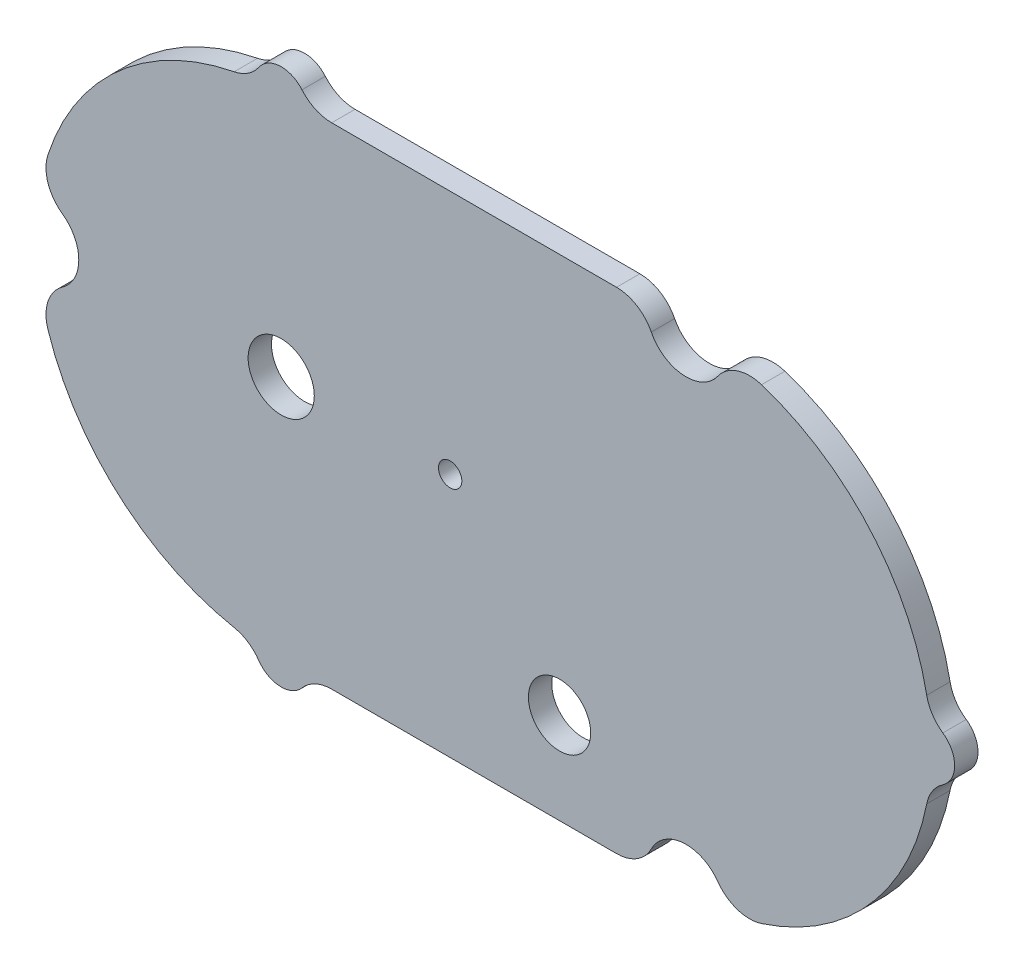
ISO-10303-21;
HEADER;
FILE_DESCRIPTION(('STEP AP214'),'2;1');
FILE_NAME('part.step','',(''),(''),'','','');
FILE_SCHEMA(('AUTOMOTIVE_DESIGN { 1 0 10303 214 1 1 1 1 }'));
ENDSEC;
DATA;
#1=APPLICATION_CONTEXT('core data for automotive mechanical design processes');
#2=APPLICATION_PROTOCOL_DEFINITION('international standard','automotive_design',2000,#1);
#3=PRODUCT_CONTEXT('',#1,'mechanical');
#4=PRODUCT('Part','Part','',(#3));
#5=PRODUCT_RELATED_PRODUCT_CATEGORY('part','',(#4));
#6=PRODUCT_DEFINITION_FORMATION('','',#4);
#7=PRODUCT_DEFINITION_CONTEXT('part definition',#1,'design');
#8=PRODUCT_DEFINITION('design','',#6,#7);
#9=PRODUCT_DEFINITION_SHAPE('','',#8);
#10=(LENGTH_UNIT() NAMED_UNIT(*) SI_UNIT(.MILLI.,.METRE.));
#11=(NAMED_UNIT(*) PLANE_ANGLE_UNIT() SI_UNIT($,.RADIAN.));
#12=(NAMED_UNIT(*) SI_UNIT($,.STERADIAN.) SOLID_ANGLE_UNIT());
#13=UNCERTAINTY_MEASURE_WITH_UNIT(LENGTH_MEASURE(1.E-05),#10,'distance_accuracy_value','');
#14=(GEOMETRIC_REPRESENTATION_CONTEXT(3) GLOBAL_UNCERTAINTY_ASSIGNED_CONTEXT((#13)) GLOBAL_UNIT_ASSIGNED_CONTEXT((#10,
#11,#12)) REPRESENTATION_CONTEXT('',''));
#15=CARTESIAN_POINT('',(0.,0.,0.));
#16=DIRECTION('',(0.,0.,1.));
#17=DIRECTION('',(1.,0.,0.));
#18=AXIS2_PLACEMENT_3D('',#15,#16,#17);
#19=CARTESIAN_POINT('',(0.,31.,-3.));
#20=DIRECTION('',(0.,0.,1.));
#21=DIRECTION('',(1.,0.,0.));
#22=AXIS2_PLACEMENT_3D('',#19,#20,#21);
#23=CYLINDRICAL_SURFACE('',#22,3.5);
#24=CARTESIAN_POINT('',(0.,31.,0.));
#25=DIRECTION('',(0.,0.,1.));
#26=DIRECTION('',(1.,0.,0.));
#27=AXIS2_PLACEMENT_3D('',#24,#25,#26);
#28=CIRCLE('',#27,3.5);
#29=CARTESIAN_POINT('',(2.6685402875797,33.2647058823529,0.));
#30=VERTEX_POINT('',#29);
#31=CARTESIAN_POINT('',(-2.8821386955939,32.9857685009488,0.));
#32=VERTEX_POINT('',#31);
#33=EDGE_CURVE('E307',#30,#32,#28,.T.);
#34=ORIENTED_EDGE('',*,*,#33,.F.);
#35=DIRECTION('',(0.,0.,1.));
#36=VECTOR('',#35,1.);
#37=CARTESIAN_POINT('',(2.6685402875797,33.2647058823529,-3.));
#38=LINE('',#37,#36);
#39=CARTESIAN_POINT('',(2.6685402875797,33.2647058823529,-3.));
#40=VERTEX_POINT('',#39);
#41=EDGE_CURVE('E354',#30,#40,#38,.F.);
#42=ORIENTED_EDGE('',*,*,#41,.T.);
#43=CARTESIAN_POINT('',(0.,31.,-3.));
#44=DIRECTION('',(0.,0.,1.));
#45=DIRECTION('',(1.,0.,0.));
#46=AXIS2_PLACEMENT_3D('',#43,#44,#45);
#47=CIRCLE('',#46,3.5);
#48=CARTESIAN_POINT('',(-2.8821386955939,32.9857685009488,-3.));
#49=VERTEX_POINT('',#48);
#50=EDGE_CURVE('E290',#40,#49,#47,.T.);
#51=ORIENTED_EDGE('',*,*,#50,.T.);
#52=DIRECTION('',(0.,0.,1.));
#53=VECTOR('',#52,1.);
#54=CARTESIAN_POINT('',(-2.8821386955939,32.9857685009488,-3.));
#55=LINE('',#54,#53);
#56=EDGE_CURVE('E352',#49,#32,#55,.T.);
#57=ORIENTED_EDGE('',*,*,#56,.T.);
#58=EDGE_LOOP('',(#34,#42,#51,#57));
#59=FACE_BOUND('',#58,.T.);
#60=ADVANCED_FACE('F37',(#59),#23,.T.);
#61=CARTESIAN_POINT('',(0.,31.5,-3.));
#62=DIRECTION('',(0.,-1.,0.));
#63=DIRECTION('',(1.,0.,0.));
#64=AXIS2_PLACEMENT_3D('',#61,#62,#63);
#65=PLANE('',#64);
#66=DIRECTION('',(1.,0.,0.));
#67=VECTOR('',#66,1.);
#68=CARTESIAN_POINT('',(0.,31.5,0.));
#69=LINE('',#68,#67);
#70=CARTESIAN_POINT('',(6.48074069840786,31.5,0.));
#71=VERTEX_POINT('',#70);
#72=CARTESIAN_POINT('',(43.0697144502541,31.5,0.));
#73=VERTEX_POINT('',#72);
#74=EDGE_CURVE('E230',#71,#73,#69,.T.);
#75=ORIENTED_EDGE('',*,*,#74,.T.);
#76=DIRECTION('',(0.,0.,-1.));
#77=VECTOR('',#76,1.);
#78=CARTESIAN_POINT('',(43.0697144502541,31.5,-3.));
#79=LINE('',#78,#77);
#80=CARTESIAN_POINT('',(43.0697144502541,31.5,-3.));
#81=VERTEX_POINT('',#80);
#82=EDGE_CURVE('E450',#73,#81,#79,.T.);
#83=ORIENTED_EDGE('',*,*,#82,.T.);
#84=DIRECTION('',(1.,0.,0.));
#85=VECTOR('',#84,1.);
#86=CARTESIAN_POINT('',(0.,31.5,-3.));
#87=LINE('',#86,#85);
#88=CARTESIAN_POINT('',(6.48074069840786,31.5,-3.));
#89=VERTEX_POINT('',#88);
#90=EDGE_CURVE('E320',#89,#81,#87,.T.);
#91=ORIENTED_EDGE('',*,*,#90,.F.);
#92=DIRECTION('',(0.,0.,1.));
#93=VECTOR('',#92,1.);
#94=CARTESIAN_POINT('',(6.48074069840786,31.5,-3.));
#95=LINE('',#94,#93);
#96=EDGE_CURVE('E452',#89,#71,#95,.T.);
#97=ORIENTED_EDGE('',*,*,#96,.T.);
#98=EDGE_LOOP('',(#75,#83,#91,#97));
#99=FACE_BOUND('',#98,.T.);
#100=ADVANCED_FACE('F475',(#99),#65,.F.);
#101=CARTESIAN_POINT('',(52.,31.,-3.));
#102=DIRECTION('',(0.,0.,1.));
#103=DIRECTION('',(1.,0.,0.));
#104=AXIS2_PLACEMENT_3D('',#101,#102,#103);
#105=CYLINDRICAL_SURFACE('',#104,5.);
#106=CARTESIAN_POINT('',(52.,31.,0.));
#107=DIRECTION('',(0.,0.,1.));
#108=DIRECTION('',(1.,0.,0.));
#109=AXIS2_PLACEMENT_3D('',#106,#107,#108);
#110=CIRCLE('',#109,5.);
#111=CARTESIAN_POINT('',(56.0779542758229,28.1068548387097,0.));
#112=VERTEX_POINT('',#111);
#113=CARTESIAN_POINT('',(47.534857225127,28.75,0.));
#114=VERTEX_POINT('',#113);
#115=EDGE_CURVE('E226',#112,#114,#110,.F.);
#116=ORIENTED_EDGE('',*,*,#115,.F.);
#117=DIRECTION('',(0.,0.,1.));
#118=VECTOR('',#117,1.);
#119=CARTESIAN_POINT('',(56.0779542758229,28.1068548387097,-3.));
#120=LINE('',#119,#118);
#121=CARTESIAN_POINT('',(56.0779542758229,28.1068548387097,-3.));
#122=VERTEX_POINT('',#121);
#123=EDGE_CURVE('E204',#112,#122,#120,.F.);
#124=ORIENTED_EDGE('',*,*,#123,.T.);
#125=CARTESIAN_POINT('',(52.,31.,-3.));
#126=DIRECTION('',(0.,0.,1.));
#127=DIRECTION('',(1.,0.,0.));
#128=AXIS2_PLACEMENT_3D('',#125,#126,#127);
#129=CIRCLE('',#128,5.);
#130=CARTESIAN_POINT('',(47.534857225127,28.75,-3.));
#131=VERTEX_POINT('',#130);
#132=EDGE_CURVE('E323',#122,#131,#129,.F.);
#133=ORIENTED_EDGE('',*,*,#132,.T.);
#134=DIRECTION('',(0.,0.,1.));
#135=VECTOR('',#134,1.);
#136=CARTESIAN_POINT('',(47.534857225127,28.75,-3.));
#137=LINE('',#136,#135);
#138=EDGE_CURVE('E209',#131,#114,#137,.T.);
#139=ORIENTED_EDGE('',*,*,#138,.T.);
#140=EDGE_LOOP('',(#116,#124,#133,#139));
#141=FACE_BOUND('',#140,.T.);
#142=ADVANCED_FACE('F469',(#141),#105,.F.);
#143=CARTESIAN_POINT('',(52.,0.,-3.));
#144=DIRECTION('',(0.,0.,1.));
#145=DIRECTION('',(1.,0.,0.));
#146=AXIS2_PLACEMENT_3D('',#143,#144,#145);
#147=CYLINDRICAL_SURFACE('',#146,31.5);
#148=CARTESIAN_POINT('',(52.,0.,-3.));
#149=DIRECTION('',(0.,0.,1.));
#150=DIRECTION('',(1.,0.,0.));
#151=AXIS2_PLACEMENT_3D('',#148,#149,#150);
#152=CIRCLE('',#151,31.5);
#153=CARTESIAN_POINT('',(61.6947592217677,29.97101339014,-3.));
#154=VERTEX_POINT('',#153);
#155=CARTESIAN_POINT('',(82.915377817057,6.04064685514886,-3.));
#156=VERTEX_POINT('',#155);
#157=EDGE_CURVE('E219',#154,#156,#152,.F.);
#158=ORIENTED_EDGE('',*,*,#157,.F.);
#159=DIRECTION('',(0.,0.,1.));
#160=VECTOR('',#159,1.);
#161=CARTESIAN_POINT('',(61.6947592217677,29.97101339014,-3.));
#162=LINE('',#161,#160);
#163=CARTESIAN_POINT('',(61.6947592217677,29.97101339014,0.));
#164=VERTEX_POINT('',#163);
#165=EDGE_CURVE('E203',#154,#164,#162,.T.);
#166=ORIENTED_EDGE('',*,*,#165,.T.);
#167=CARTESIAN_POINT('',(52.,0.,0.));
#168=DIRECTION('',(0.,0.,1.));
#169=DIRECTION('',(1.,0.,0.));
#170=AXIS2_PLACEMENT_3D('',#167,#168,#169);
#171=CIRCLE('',#170,31.5);
#172=CARTESIAN_POINT('',(82.915377817057,6.04064685514886,0.));
#173=VERTEX_POINT('',#172);
#174=EDGE_CURVE('E216',#164,#173,#171,.F.);
#175=ORIENTED_EDGE('',*,*,#174,.T.);
#176=DIRECTION('',(0.,0.,1.));
#177=VECTOR('',#176,1.);
#178=CARTESIAN_POINT('',(82.915377817057,6.04064685514886,-3.));
#179=LINE('',#178,#177);
#180=EDGE_CURVE('E221',#173,#156,#179,.F.);
#181=ORIENTED_EDGE('',*,*,#180,.T.);
#182=EDGE_LOOP('',(#158,#166,#175,#181));
#183=FACE_BOUND('',#182,.T.);
#184=ADVANCED_FACE('F215',(#183),#147,.T.);
#185=CARTESIAN_POINT('',(83.,0.,-3.));
#186=DIRECTION('',(0.,0.,1.));
#187=DIRECTION('',(1.,0.,0.));
#188=AXIS2_PLACEMENT_3D('',#185,#186,#187);
#189=CYLINDRICAL_SURFACE('',#188,3.50000000000001);
#190=CARTESIAN_POINT('',(83.,0.,0.));
#191=DIRECTION('',(0.,0.,1.));
#192=DIRECTION('',(1.,0.,0.));
#193=AXIS2_PLACEMENT_3D('',#190,#191,#192);
#194=CIRCLE('',#193,3.50000000000001);
#195=CARTESIAN_POINT('',(84.9857685009488,-2.8821386955939,0.));
#196=VERTEX_POINT('',#195);
#197=CARTESIAN_POINT('',(84.9857685009488,2.8821386955939,0.));
#198=VERTEX_POINT('',#197);
#199=EDGE_CURVE('E227',#196,#198,#194,.T.);
#200=ORIENTED_EDGE('',*,*,#199,.F.);
#201=DIRECTION('',(0.,0.,1.));
#202=VECTOR('',#201,1.);
#203=CARTESIAN_POINT('',(84.9857685009488,-2.8821386955939,-3.));
#204=LINE('',#203,#202);
#205=CARTESIAN_POINT('',(84.9857685009488,-2.8821386955939,-3.));
#206=VERTEX_POINT('',#205);
#207=EDGE_CURVE('E361',#196,#206,#204,.F.);
#208=ORIENTED_EDGE('',*,*,#207,.T.);
#209=CARTESIAN_POINT('',(83.,0.,-3.));
#210=DIRECTION('',(0.,0.,1.));
#211=DIRECTION('',(1.,0.,0.));
#212=AXIS2_PLACEMENT_3D('',#209,#210,#211);
#213=CIRCLE('',#212,3.50000000000001);
#214=CARTESIAN_POINT('',(84.9857685009488,2.8821386955939,-3.));
#215=VERTEX_POINT('',#214);
#216=EDGE_CURVE('E326',#206,#215,#213,.T.);
#217=ORIENTED_EDGE('',*,*,#216,.T.);
#218=DIRECTION('',(0.,0.,1.));
#219=VECTOR('',#218,1.);
#220=CARTESIAN_POINT('',(84.9857685009488,2.8821386955939,-3.));
#221=LINE('',#220,#219);
#222=EDGE_CURVE('E365',#215,#198,#221,.T.);
#223=ORIENTED_EDGE('',*,*,#222,.T.);
#224=EDGE_LOOP('',(#200,#208,#217,#223));
#225=FACE_BOUND('',#224,.T.);
#226=ADVANCED_FACE('F426',(#225),#189,.T.);
#227=CARTESIAN_POINT('',(82.915377817057,-6.04064685514887,0.));
#228=VERTEX_POINT('',#227);
#229=CARTESIAN_POINT('',(61.6947592217677,-29.97101339014,0.));
#230=VERTEX_POINT('',#229);
#231=EDGE_CURVE('E229',#228,#230,#171,.F.);
#232=ORIENTED_EDGE('',*,*,#231,.T.);
#233=DIRECTION('',(0.,0.,1.));
#234=VECTOR('',#233,1.);
#235=CARTESIAN_POINT('',(61.6947592217677,-29.97101339014,-3.));
#236=LINE('',#235,#234);
#237=CARTESIAN_POINT('',(61.6947592217677,-29.97101339014,-3.));
#238=VERTEX_POINT('',#237);
#239=EDGE_CURVE('E413',#230,#238,#236,.F.);
#240=ORIENTED_EDGE('',*,*,#239,.T.);
#241=CARTESIAN_POINT('',(82.915377817057,-6.04064685514887,-3.));
#242=VERTEX_POINT('',#241);
#243=EDGE_CURVE('E329',#242,#238,#152,.F.);
#244=ORIENTED_EDGE('',*,*,#243,.F.);
#245=DIRECTION('',(0.,0.,1.));
#246=VECTOR('',#245,1.);
#247=CARTESIAN_POINT('',(82.915377817057,-6.04064685514887,-3.));
#248=LINE('',#247,#246);
#249=EDGE_CURVE('E435',#242,#228,#248,.T.);
#250=ORIENTED_EDGE('',*,*,#249,.T.);
#251=EDGE_LOOP('',(#232,#240,#244,#250));
#252=FACE_BOUND('',#251,.T.);
#253=ADVANCED_FACE('F437',(#252),#147,.T.);
#254=CARTESIAN_POINT('',(52.,-31.,-3.));
#255=DIRECTION('',(0.,0.,1.));
#256=DIRECTION('',(1.,0.,0.));
#257=AXIS2_PLACEMENT_3D('',#254,#255,#256);
#258=CYLINDRICAL_SURFACE('',#257,5.);
#259=CARTESIAN_POINT('',(52.,-31.,0.));
#260=DIRECTION('',(0.,0.,1.));
#261=DIRECTION('',(1.,0.,0.));
#262=AXIS2_PLACEMENT_3D('',#259,#260,#261);
#263=CIRCLE('',#262,5.);
#264=CARTESIAN_POINT('',(47.534857225127,-28.75,0.));
#265=VERTEX_POINT('',#264);
#266=CARTESIAN_POINT('',(56.0779542758229,-28.1068548387097,0.));
#267=VERTEX_POINT('',#266);
#268=EDGE_CURVE('E235',#265,#267,#263,.F.);
#269=ORIENTED_EDGE('',*,*,#268,.F.);
#270=DIRECTION('',(0.,0.,1.));
#271=VECTOR('',#270,1.);
#272=CARTESIAN_POINT('',(47.534857225127,-28.75,-3.));
#273=LINE('',#272,#271);
#274=CARTESIAN_POINT('',(47.534857225127,-28.75,-3.));
#275=VERTEX_POINT('',#274);
#276=EDGE_CURVE('E438',#265,#275,#273,.F.);
#277=ORIENTED_EDGE('',*,*,#276,.T.);
#278=CARTESIAN_POINT('',(52.,-31.,-3.));
#279=DIRECTION('',(0.,0.,1.));
#280=DIRECTION('',(1.,0.,0.));
#281=AXIS2_PLACEMENT_3D('',#278,#279,#280);
#282=CIRCLE('',#281,5.);
#283=CARTESIAN_POINT('',(56.0779542758229,-28.1068548387097,-3.));
#284=VERTEX_POINT('',#283);
#285=EDGE_CURVE('E332',#275,#284,#282,.F.);
#286=ORIENTED_EDGE('',*,*,#285,.T.);
#287=DIRECTION('',(0.,0.,1.));
#288=VECTOR('',#287,1.);
#289=CARTESIAN_POINT('',(56.0779542758229,-28.1068548387097,-3.));
#290=LINE('',#289,#288);
#291=EDGE_CURVE('E440',#284,#267,#290,.T.);
#292=ORIENTED_EDGE('',*,*,#291,.T.);
#293=EDGE_LOOP('',(#269,#277,#286,#292));
#294=FACE_BOUND('',#293,.T.);
#295=ADVANCED_FACE('F543',(#294),#258,.F.);
#296=CARTESIAN_POINT('',(0.,-31.5,-3.));
#297=DIRECTION('',(0.,-1.,0.));
#298=DIRECTION('',(1.,0.,0.));
#299=AXIS2_PLACEMENT_3D('',#296,#297,#298);
#300=PLANE('',#299);
#301=DIRECTION('',(1.,0.,0.));
#302=VECTOR('',#301,1.);
#303=CARTESIAN_POINT('',(0.,-31.5,-3.));
#304=LINE('',#303,#302);
#305=CARTESIAN_POINT('',(6.48074069840787,-31.5,-3.));
#306=VERTEX_POINT('',#305);
#307=CARTESIAN_POINT('',(43.0697144502541,-31.5,-3.));
#308=VERTEX_POINT('',#307);
#309=EDGE_CURVE('E335',#306,#308,#304,.T.);
#310=ORIENTED_EDGE('',*,*,#309,.T.);
#311=DIRECTION('',(0.,0.,1.));
#312=VECTOR('',#311,1.);
#313=CARTESIAN_POINT('',(43.0697144502541,-31.5,-3.));
#314=LINE('',#313,#312);
#315=CARTESIAN_POINT('',(43.0697144502541,-31.5,0.));
#316=VERTEX_POINT('',#315);
#317=EDGE_CURVE('E445',#308,#316,#314,.T.);
#318=ORIENTED_EDGE('',*,*,#317,.T.);
#319=DIRECTION('',(1.,0.,0.));
#320=VECTOR('',#319,1.);
#321=CARTESIAN_POINT('',(0.,-31.5,0.));
#322=LINE('',#321,#320);
#323=CARTESIAN_POINT('',(6.48074069840787,-31.5,0.));
#324=VERTEX_POINT('',#323);
#325=EDGE_CURVE('E241',#324,#316,#322,.T.);
#326=ORIENTED_EDGE('',*,*,#325,.F.);
#327=DIRECTION('',(0.,0.,-1.));
#328=VECTOR('',#327,1.);
#329=CARTESIAN_POINT('',(6.48074069840787,-31.5,-3.));
#330=LINE('',#329,#328);
#331=EDGE_CURVE('E448',#324,#306,#330,.T.);
#332=ORIENTED_EDGE('',*,*,#331,.T.);
#333=EDGE_LOOP('',(#310,#318,#326,#332));
#334=FACE_BOUND('',#333,.T.);
#335=ADVANCED_FACE('F550',(#334),#300,.T.);
#336=CARTESIAN_POINT('',(0.,-31.,-3.));
#337=DIRECTION('',(0.,0.,1.));
#338=DIRECTION('',(1.,0.,0.));
#339=AXIS2_PLACEMENT_3D('',#336,#337,#338);
#340=CYLINDRICAL_SURFACE('',#339,3.5);
#341=CARTESIAN_POINT('',(0.,-31.,0.));
#342=DIRECTION('',(0.,0.,1.));
#343=DIRECTION('',(1.,0.,0.));
#344=AXIS2_PLACEMENT_3D('',#341,#342,#343);
#345=CIRCLE('',#344,3.5);
#346=CARTESIAN_POINT('',(-2.88213869559389,-32.9857685009488,0.));
#347=VERTEX_POINT('',#346);
#348=CARTESIAN_POINT('',(2.66854028757972,-33.2647058823529,0.));
#349=VERTEX_POINT('',#348);
#350=EDGE_CURVE('E244',#347,#349,#345,.T.);
#351=ORIENTED_EDGE('',*,*,#350,.F.);
#352=DIRECTION('',(0.,0.,1.));
#353=VECTOR('',#352,1.);
#354=CARTESIAN_POINT('',(-2.88213869559389,-32.9857685009488,-3.));
#355=LINE('',#354,#353);
#356=CARTESIAN_POINT('',(-2.88213869559389,-32.9857685009488,-3.));
#357=VERTEX_POINT('',#356);
#358=EDGE_CURVE('E421',#347,#357,#355,.F.);
#359=ORIENTED_EDGE('',*,*,#358,.T.);
#360=CARTESIAN_POINT('',(0.,-31.,-3.));
#361=DIRECTION('',(0.,0.,1.));
#362=DIRECTION('',(1.,0.,0.));
#363=AXIS2_PLACEMENT_3D('',#360,#361,#362);
#364=CIRCLE('',#363,3.5);
#365=CARTESIAN_POINT('',(2.66854028757972,-33.2647058823529,-3.));
#366=VERTEX_POINT('',#365);
#367=EDGE_CURVE('E338',#357,#366,#364,.T.);
#368=ORIENTED_EDGE('',*,*,#367,.T.);
#369=DIRECTION('',(0.,0.,1.));
#370=VECTOR('',#369,1.);
#371=CARTESIAN_POINT('',(2.66854028757972,-33.2647058823529,-3.));
#372=LINE('',#371,#370);
#373=EDGE_CURVE('E418',#366,#349,#372,.T.);
#374=ORIENTED_EDGE('',*,*,#373,.T.);
#375=EDGE_LOOP('',(#351,#359,#368,#374));
#376=FACE_BOUND('',#375,.T.);
#377=ADVANCED_FACE('F530',(#376),#340,.T.);
#378=CARTESIAN_POINT('',(0.,0.,-3.));
#379=DIRECTION('',(0.,0.,1.));
#380=DIRECTION('',(1.,0.,0.));
#381=AXIS2_PLACEMENT_3D('',#378,#379,#380);
#382=CYLINDRICAL_SURFACE('',#381,31.5);
#383=CARTESIAN_POINT('',(0.,0.,0.));
#384=DIRECTION('',(0.,0.,1.));
#385=DIRECTION('',(1.,0.,0.));
#386=AXIS2_PLACEMENT_3D('',#383,#384,#385);
#387=CIRCLE('',#386,31.5);
#388=CARTESIAN_POINT('',(-29.97101339014,-9.69475922176769,0.));
#389=VERTEX_POINT('',#388);
#390=CARTESIAN_POINT('',(-6.04064685514883,-30.915377817057,0.));
#391=VERTEX_POINT('',#390);
#392=EDGE_CURVE('E303',#389,#391,#387,.T.);
#393=ORIENTED_EDGE('',*,*,#392,.F.);
#394=DIRECTION('',(0.,0.,1.));
#395=VECTOR('',#394,1.);
#396=CARTESIAN_POINT('',(-29.97101339014,-9.69475922176769,-3.));
#397=LINE('',#396,#395);
#398=CARTESIAN_POINT('',(-29.97101339014,-9.69475922176769,-3.));
#399=VERTEX_POINT('',#398);
#400=EDGE_CURVE('E411',#389,#399,#397,.F.);
#401=ORIENTED_EDGE('',*,*,#400,.T.);
#402=CARTESIAN_POINT('',(0.,0.,-3.));
#403=DIRECTION('',(0.,0.,1.));
#404=DIRECTION('',(1.,0.,0.));
#405=AXIS2_PLACEMENT_3D('',#402,#403,#404);
#406=CIRCLE('',#405,31.5);
#407=CARTESIAN_POINT('',(-6.04064685514883,-30.915377817057,-3.));
#408=VERTEX_POINT('',#407);
#409=EDGE_CURVE('E341',#399,#408,#406,.T.);
#410=ORIENTED_EDGE('',*,*,#409,.T.);
#411=DIRECTION('',(0.,0.,1.));
#412=VECTOR('',#411,1.);
#413=CARTESIAN_POINT('',(-6.04064685514883,-30.915377817057,-3.));
#414=LINE('',#413,#412);
#415=EDGE_CURVE('E408',#408,#391,#414,.T.);
#416=ORIENTED_EDGE('',*,*,#415,.T.);
#417=EDGE_LOOP('',(#393,#401,#410,#416));
#418=FACE_BOUND('',#417,.T.);
#419=ADVANCED_FACE('F538',(#418),#382,.T.);
#420=CARTESIAN_POINT('',(-31.,0.,-3.));
#421=DIRECTION('',(0.,0.,1.));
#422=DIRECTION('',(1.,0.,0.));
#423=AXIS2_PLACEMENT_3D('',#420,#421,#422);
#424=CYLINDRICAL_SURFACE('',#423,5.);
#425=CARTESIAN_POINT('',(-31.,0.,-3.));
#426=DIRECTION('',(0.,0.,1.));
#427=DIRECTION('',(1.,0.,0.));
#428=AXIS2_PLACEMENT_3D('',#425,#426,#427);
#429=CIRCLE('',#428,5.);
#430=CARTESIAN_POINT('',(-28.1068548387097,-4.07795427582292,-3.));
#431=VERTEX_POINT('',#430);
#432=CARTESIAN_POINT('',(-28.1068548387097,4.07795427582291,-3.));
#433=VERTEX_POINT('',#432);
#434=EDGE_CURVE('E342',#431,#433,#429,.T.);
#435=ORIENTED_EDGE('',*,*,#434,.F.);
#436=DIRECTION('',(0.,0.,1.));
#437=VECTOR('',#436,1.);
#438=CARTESIAN_POINT('',(-28.1068548387097,-4.07795427582292,-3.));
#439=LINE('',#438,#437);
#440=CARTESIAN_POINT('',(-28.1068548387097,-4.07795427582292,0.));
#441=VERTEX_POINT('',#440);
#442=EDGE_CURVE('E405',#431,#441,#439,.T.);
#443=ORIENTED_EDGE('',*,*,#442,.T.);
#444=CARTESIAN_POINT('',(-31.,0.,0.));
#445=DIRECTION('',(0.,0.,1.));
#446=DIRECTION('',(1.,0.,0.));
#447=AXIS2_PLACEMENT_3D('',#444,#445,#446);
#448=CIRCLE('',#447,5.);
#449=CARTESIAN_POINT('',(-28.1068548387097,4.07795427582291,0.));
#450=VERTEX_POINT('',#449);
#451=EDGE_CURVE('E300',#441,#450,#448,.T.);
#452=ORIENTED_EDGE('',*,*,#451,.T.);
#453=DIRECTION('',(0.,0.,1.));
#454=VECTOR('',#453,1.);
#455=CARTESIAN_POINT('',(-28.1068548387097,4.07795427582291,-3.));
#456=LINE('',#455,#454);
#457=EDGE_CURVE('E398',#450,#433,#456,.F.);
#458=ORIENTED_EDGE('',*,*,#457,.T.);
#459=EDGE_LOOP('',(#435,#443,#452,#458));
#460=FACE_BOUND('',#459,.T.);
#461=ADVANCED_FACE('F403',(#460),#424,.F.);
#462=CARTESIAN_POINT('',(21.7,0.,-3.));
#463=DIRECTION('',(0.,0.,1.));
#464=DIRECTION('',(1.,0.,0.));
#465=AXIS2_PLACEMENT_3D('',#462,#463,#464);
#466=CYLINDRICAL_SURFACE('',#465,1.5);
#467=CARTESIAN_POINT('',(21.7,0.,-3.));
#468=DIRECTION('',(0.,0.,1.));
#469=DIRECTION('',(1.,0.,0.));
#470=AXIS2_PLACEMENT_3D('',#467,#468,#469);
#471=CIRCLE('',#470,1.5);
#472=CARTESIAN_POINT('',(23.2,0.,-3.));
#473=VERTEX_POINT('',#472);
#474=EDGE_CURVE('E314',#473,#473,#471,.T.);
#475=ORIENTED_EDGE('',*,*,#474,.F.);
#476=EDGE_LOOP('',(#475));
#477=FACE_BOUND('',#476,.T.);
#478=CARTESIAN_POINT('',(21.7,0.,0.));
#479=DIRECTION('',(0.,0.,1.));
#480=DIRECTION('',(1.,0.,0.));
#481=AXIS2_PLACEMENT_3D('',#478,#479,#480);
#482=CIRCLE('',#481,1.5);
#483=CARTESIAN_POINT('',(23.2,0.,0.));
#484=VERTEX_POINT('',#483);
#485=EDGE_CURVE('E281',#484,#484,#482,.T.);
#486=ORIENTED_EDGE('',*,*,#485,.T.);
#487=EDGE_LOOP('',(#486));
#488=FACE_BOUND('',#487,.T.);
#489=ADVANCED_FACE('F564',(#477,#488),#466,.F.);
#490=CARTESIAN_POINT('',(35.75,-19.75,-3.));
#491=DIRECTION('',(0.,0.,1.));
#492=DIRECTION('',(1.,0.,0.));
#493=AXIS2_PLACEMENT_3D('',#490,#491,#492);
#494=CYLINDRICAL_SURFACE('',#493,4.00000000000001);
#495=CARTESIAN_POINT('',(35.75,-19.75,-3.));
#496=DIRECTION('',(0.,0.,1.));
#497=DIRECTION('',(1.,0.,0.));
#498=AXIS2_PLACEMENT_3D('',#495,#496,#497);
#499=CIRCLE('',#498,4.00000000000001);
#500=CARTESIAN_POINT('',(39.75,-19.75,-3.));
#501=VERTEX_POINT('',#500);
#502=EDGE_CURVE('E317',#501,#501,#499,.T.);
#503=ORIENTED_EDGE('',*,*,#502,.F.);
#504=EDGE_LOOP('',(#503));
#505=FACE_BOUND('',#504,.T.);
#506=CARTESIAN_POINT('',(35.75,-19.75,0.));
#507=DIRECTION('',(0.,0.,1.));
#508=DIRECTION('',(1.,0.,0.));
#509=AXIS2_PLACEMENT_3D('',#506,#507,#508);
#510=CIRCLE('',#509,4.00000000000001);
#511=CARTESIAN_POINT('',(39.75,-19.75,0.));
#512=VERTEX_POINT('',#511);
#513=EDGE_CURVE('E277',#512,#512,#510,.T.);
#514=ORIENTED_EDGE('',*,*,#513,.T.);
#515=EDGE_LOOP('',(#514));
#516=FACE_BOUND('',#515,.T.);
#517=ADVANCED_FACE('F567',(#505,#516),#494,.F.);
#518=CARTESIAN_POINT('',(-6.04064685514886,30.915377817057,0.));
#519=VERTEX_POINT('',#518);
#520=CARTESIAN_POINT('',(-29.97101339014,9.69475922176767,0.));
#521=VERTEX_POINT('',#520);
#522=EDGE_CURVE('E304',#519,#521,#387,.T.);
#523=ORIENTED_EDGE('',*,*,#522,.F.);
#524=DIRECTION('',(0.,0.,1.));
#525=VECTOR('',#524,1.);
#526=CARTESIAN_POINT('',(-6.04064685514886,30.915377817057,-3.));
#527=LINE('',#526,#525);
#528=CARTESIAN_POINT('',(-6.04064685514886,30.915377817057,-3.));
#529=VERTEX_POINT('',#528);
#530=EDGE_CURVE('E59',#519,#529,#527,.F.);
#531=ORIENTED_EDGE('',*,*,#530,.T.);
#532=CARTESIAN_POINT('',(-29.97101339014,9.69475922176767,-3.));
#533=VERTEX_POINT('',#532);
#534=EDGE_CURVE('E344',#529,#533,#406,.T.);
#535=ORIENTED_EDGE('',*,*,#534,.T.);
#536=DIRECTION('',(0.,0.,1.));
#537=VECTOR('',#536,1.);
#538=CARTESIAN_POINT('',(-29.97101339014,9.69475922176767,-3.));
#539=LINE('',#538,#537);
#540=EDGE_CURVE('E363',#533,#521,#539,.T.);
#541=ORIENTED_EDGE('',*,*,#540,.T.);
#542=EDGE_LOOP('',(#523,#531,#535,#541));
#543=FACE_BOUND('',#542,.T.);
#544=ADVANCED_FACE('F393',(#543),#382,.T.);
#545=CARTESIAN_POINT('',(0.,0.,-3.));
#546=DIRECTION('',(0.,0.,1.));
#547=DIRECTION('',(1.,0.,0.));
#548=AXIS2_PLACEMENT_3D('',#545,#546,#547);
#549=CYLINDRICAL_SURFACE('',#548,4.25);
#550=CARTESIAN_POINT('',(0.,0.,-3.));
#551=DIRECTION('',(0.,0.,1.));
#552=DIRECTION('',(1.,0.,0.));
#553=AXIS2_PLACEMENT_3D('',#550,#551,#552);
#554=CIRCLE('',#553,4.25);
#555=CARTESIAN_POINT('',(4.25,0.,-3.));
#556=VERTEX_POINT('',#555);
#557=EDGE_CURVE('E291',#556,#556,#554,.T.);
#558=ORIENTED_EDGE('',*,*,#557,.F.);
#559=EDGE_LOOP('',(#558));
#560=FACE_BOUND('',#559,.T.);
#561=CARTESIAN_POINT('',(0.,0.,0.));
#562=DIRECTION('',(0.,0.,1.));
#563=DIRECTION('',(1.,0.,0.));
#564=AXIS2_PLACEMENT_3D('',#561,#562,#563);
#565=CIRCLE('',#564,4.25);
#566=CARTESIAN_POINT('',(4.25,0.,0.));
#567=VERTEX_POINT('',#566);
#568=EDGE_CURVE('E286',#567,#567,#565,.T.);
#569=ORIENTED_EDGE('',*,*,#568,.T.);
#570=EDGE_LOOP('',(#569));
#571=FACE_BOUND('',#570,.T.);
#572=ADVANCED_FACE('F566',(#560,#571),#549,.F.);
#573=CARTESIAN_POINT('',(0.,0.,-3.));
#574=DIRECTION('',(0.,0.,1.));
#575=DIRECTION('',(1.,0.,0.));
#576=AXIS2_PLACEMENT_3D('',#573,#574,#575);
#577=PLANE('',#576);
#578=ORIENTED_EDGE('',*,*,#132,.F.);
#579=CARTESIAN_POINT('',(60.1559085516458,25.2137096774194,-3.));
#580=DIRECTION('',(0.,0.,1.));
#581=DIRECTION('',(1.,0.,0.));
#582=AXIS2_PLACEMENT_3D('',#579,#580,#581);
#583=CIRCLE('',#582,5.);
#584=EDGE_CURVE('E455',#122,#154,#583,.F.);
#585=ORIENTED_EDGE('',*,*,#584,.T.);
#586=ORIENTED_EDGE('',*,*,#157,.T.);
#587=CARTESIAN_POINT('',(87.8225806451613,6.99947968929947,-3.));
#588=DIRECTION('',(0.,0.,1.));
#589=DIRECTION('',(1.,0.,0.));
#590=AXIS2_PLACEMENT_3D('',#587,#588,#589);
#591=CIRCLE('',#590,5.);
#592=EDGE_CURVE('E12',#156,#215,#591,.T.);
#593=ORIENTED_EDGE('',*,*,#592,.T.);
#594=ORIENTED_EDGE('',*,*,#216,.F.);
#595=CARTESIAN_POINT('',(87.8225806451613,-6.99947968929948,-3.));
#596=DIRECTION('',(0.,0.,1.));
#597=DIRECTION('',(1.,0.,0.));
#598=AXIS2_PLACEMENT_3D('',#595,#596,#597);
#599=CIRCLE('',#598,5.);
#600=EDGE_CURVE('E382',#206,#242,#599,.T.);
#601=ORIENTED_EDGE('',*,*,#600,.T.);
#602=ORIENTED_EDGE('',*,*,#243,.T.);
#603=CARTESIAN_POINT('',(60.1559085516458,-25.2137096774194,-3.));
#604=DIRECTION('',(0.,0.,1.));
#605=DIRECTION('',(1.,0.,0.));
#606=AXIS2_PLACEMENT_3D('',#603,#604,#605);
#607=CIRCLE('',#606,5.);
#608=EDGE_CURVE('E461',#238,#284,#607,.F.);
#609=ORIENTED_EDGE('',*,*,#608,.T.);
#610=ORIENTED_EDGE('',*,*,#285,.F.);
#611=CARTESIAN_POINT('',(43.0697144502541,-26.5,-3.));
#612=DIRECTION('',(0.,0.,1.));
#613=DIRECTION('',(1.,0.,0.));
#614=AXIS2_PLACEMENT_3D('',#611,#612,#613);
#615=CIRCLE('',#614,5.);
#616=EDGE_CURVE('E459',#275,#308,#615,.F.);
#617=ORIENTED_EDGE('',*,*,#616,.T.);
#618=ORIENTED_EDGE('',*,*,#309,.F.);
#619=CARTESIAN_POINT('',(6.48074069840787,-36.5,-3.));
#620=DIRECTION('',(0.,0.,1.));
#621=DIRECTION('',(1.,0.,0.));
#622=AXIS2_PLACEMENT_3D('',#619,#620,#621);
#623=CIRCLE('',#622,5.);
#624=EDGE_CURVE('E378',#306,#366,#623,.T.);
#625=ORIENTED_EDGE('',*,*,#624,.T.);
#626=ORIENTED_EDGE('',*,*,#367,.F.);
#627=CARTESIAN_POINT('',(-6.99947968929944,-35.8225806451613,-3.));
#628=DIRECTION('',(0.,0.,1.));
#629=DIRECTION('',(1.,0.,0.));
#630=AXIS2_PLACEMENT_3D('',#627,#628,#629);
#631=CIRCLE('',#630,5.);
#632=EDGE_CURVE('E374',#357,#408,#631,.T.);
#633=ORIENTED_EDGE('',*,*,#632,.T.);
#634=ORIENTED_EDGE('',*,*,#409,.F.);
#635=CARTESIAN_POINT('',(-25.2137096774194,-8.15590855164583,-3.));
#636=DIRECTION('',(0.,0.,1.));
#637=DIRECTION('',(1.,0.,0.));
#638=AXIS2_PLACEMENT_3D('',#635,#636,#637);
#639=CIRCLE('',#638,5.);
#640=EDGE_CURVE('E463',#399,#431,#639,.F.);
#641=ORIENTED_EDGE('',*,*,#640,.T.);
#642=ORIENTED_EDGE('',*,*,#434,.T.);
#643=CARTESIAN_POINT('',(-25.2137096774194,8.15590855164582,-3.));
#644=DIRECTION('',(0.,0.,1.));
#645=DIRECTION('',(1.,0.,0.));
#646=AXIS2_PLACEMENT_3D('',#643,#644,#645);
#647=CIRCLE('',#646,5.);
#648=EDGE_CURVE('E52',#433,#533,#647,.F.);
#649=ORIENTED_EDGE('',*,*,#648,.T.);
#650=ORIENTED_EDGE('',*,*,#534,.F.);
#651=CARTESIAN_POINT('',(-6.99947968929947,35.8225806451613,-3.));
#652=DIRECTION('',(0.,0.,1.));
#653=DIRECTION('',(1.,0.,0.));
#654=AXIS2_PLACEMENT_3D('',#651,#652,#653);
#655=CIRCLE('',#654,5.);
#656=EDGE_CURVE('E359',#529,#49,#655,.T.);
#657=ORIENTED_EDGE('',*,*,#656,.T.);
#658=ORIENTED_EDGE('',*,*,#50,.F.);
#659=CARTESIAN_POINT('',(6.48074069840786,36.5,-3.));
#660=DIRECTION('',(0.,0.,1.));
#661=DIRECTION('',(1.,0.,0.));
#662=AXIS2_PLACEMENT_3D('',#659,#660,#661);
#663=CIRCLE('',#662,5.);
#664=EDGE_CURVE('E386',#40,#89,#663,.T.);
#665=ORIENTED_EDGE('',*,*,#664,.T.);
#666=ORIENTED_EDGE('',*,*,#90,.T.);
#667=CARTESIAN_POINT('',(43.0697144502541,26.5,-3.));
#668=DIRECTION('',(0.,0.,1.));
#669=DIRECTION('',(1.,0.,0.));
#670=AXIS2_PLACEMENT_3D('',#667,#668,#669);
#671=CIRCLE('',#670,5.);
#672=EDGE_CURVE('E457',#81,#131,#671,.F.);
#673=ORIENTED_EDGE('',*,*,#672,.T.);
#674=EDGE_LOOP('',(#578,#585,#586,#593,#594,#601,#602,#609,#610,#617,#618,#625,#626,#633,#634,
#641,#642,#649,#650,#657,#658,#665,#666,#673));
#675=FACE_BOUND('',#674,.T.);
#676=ORIENTED_EDGE('',*,*,#502,.T.);
#677=EDGE_LOOP('',(#676));
#678=FACE_BOUND('',#677,.T.);
#679=ORIENTED_EDGE('',*,*,#474,.T.);
#680=EDGE_LOOP('',(#679));
#681=FACE_BOUND('',#680,.T.);
#682=ORIENTED_EDGE('',*,*,#557,.T.);
#683=EDGE_LOOP('',(#682));
#684=FACE_BOUND('',#683,.T.);
#685=ADVANCED_FACE('F390',(#675,#678,#681,#684),#577,.F.);
#686=CARTESIAN_POINT('',(0.,0.,0.));
#687=DIRECTION('',(0.,0.,1.));
#688=DIRECTION('',(1.,0.,0.));
#689=AXIS2_PLACEMENT_3D('',#686,#687,#688);
#690=PLANE('',#689);
#691=ORIENTED_EDGE('',*,*,#174,.F.);
#692=CARTESIAN_POINT('',(60.1559085516458,25.2137096774194,0.));
#693=DIRECTION('',(0.,0.,1.));
#694=DIRECTION('',(1.,0.,0.));
#695=AXIS2_PLACEMENT_3D('',#692,#693,#694);
#696=CIRCLE('',#695,5.);
#697=EDGE_CURVE('E199',#164,#112,#696,.T.);
#698=ORIENTED_EDGE('',*,*,#697,.T.);
#699=ORIENTED_EDGE('',*,*,#115,.T.);
#700=CARTESIAN_POINT('',(43.0697144502541,26.5,0.));
#701=DIRECTION('',(0.,0.,1.));
#702=DIRECTION('',(1.,0.,0.));
#703=AXIS2_PLACEMENT_3D('',#700,#701,#702);
#704=CIRCLE('',#703,5.);
#705=EDGE_CURVE('E210',#114,#73,#704,.T.);
#706=ORIENTED_EDGE('',*,*,#705,.T.);
#707=ORIENTED_EDGE('',*,*,#74,.F.);
#708=CARTESIAN_POINT('',(6.48074069840786,36.5,0.));
#709=DIRECTION('',(0.,0.,1.));
#710=DIRECTION('',(1.,0.,0.));
#711=AXIS2_PLACEMENT_3D('',#708,#709,#710);
#712=CIRCLE('',#711,5.);
#713=EDGE_CURVE('E384',#71,#30,#712,.F.);
#714=ORIENTED_EDGE('',*,*,#713,.T.);
#715=ORIENTED_EDGE('',*,*,#33,.T.);
#716=CARTESIAN_POINT('',(-6.99947968929947,35.8225806451613,0.));
#717=DIRECTION('',(0.,0.,1.));
#718=DIRECTION('',(1.,0.,0.));
#719=AXIS2_PLACEMENT_3D('',#716,#717,#718);
#720=CIRCLE('',#719,5.);
#721=EDGE_CURVE('E360',#32,#519,#720,.F.);
#722=ORIENTED_EDGE('',*,*,#721,.T.);
#723=ORIENTED_EDGE('',*,*,#522,.T.);
#724=CARTESIAN_POINT('',(-25.2137096774194,8.15590855164582,0.));
#725=DIRECTION('',(0.,0.,1.));
#726=DIRECTION('',(1.,0.,0.));
#727=AXIS2_PLACEMENT_3D('',#724,#725,#726);
#728=CIRCLE('',#727,5.);
#729=EDGE_CURVE('E220',#521,#450,#728,.T.);
#730=ORIENTED_EDGE('',*,*,#729,.T.);
#731=ORIENTED_EDGE('',*,*,#451,.F.);
#732=CARTESIAN_POINT('',(-25.2137096774194,-8.15590855164583,0.));
#733=DIRECTION('',(0.,0.,1.));
#734=DIRECTION('',(1.,0.,0.));
#735=AXIS2_PLACEMENT_3D('',#732,#733,#734);
#736=CIRCLE('',#735,5.);
#737=EDGE_CURVE('E294',#441,#389,#736,.T.);
#738=ORIENTED_EDGE('',*,*,#737,.T.);
#739=ORIENTED_EDGE('',*,*,#392,.T.);
#740=CARTESIAN_POINT('',(-6.99947968929944,-35.8225806451613,0.));
#741=DIRECTION('',(0.,0.,1.));
#742=DIRECTION('',(1.,0.,0.));
#743=AXIS2_PLACEMENT_3D('',#740,#741,#742);
#744=CIRCLE('',#743,5.);
#745=EDGE_CURVE('E372',#391,#347,#744,.F.);
#746=ORIENTED_EDGE('',*,*,#745,.T.);
#747=ORIENTED_EDGE('',*,*,#350,.T.);
#748=CARTESIAN_POINT('',(6.48074069840787,-36.5,0.));
#749=DIRECTION('',(0.,0.,1.));
#750=DIRECTION('',(1.,0.,0.));
#751=AXIS2_PLACEMENT_3D('',#748,#749,#750);
#752=CIRCLE('',#751,5.);
#753=EDGE_CURVE('E376',#349,#324,#752,.F.);
#754=ORIENTED_EDGE('',*,*,#753,.T.);
#755=ORIENTED_EDGE('',*,*,#325,.T.);
#756=CARTESIAN_POINT('',(43.0697144502541,-26.5,0.));
#757=DIRECTION('',(0.,0.,1.));
#758=DIRECTION('',(1.,0.,0.));
#759=AXIS2_PLACEMENT_3D('',#756,#757,#758);
#760=CIRCLE('',#759,5.);
#761=EDGE_CURVE('E258',#316,#265,#760,.T.);
#762=ORIENTED_EDGE('',*,*,#761,.T.);
#763=ORIENTED_EDGE('',*,*,#268,.T.);
#764=CARTESIAN_POINT('',(60.1559085516458,-25.2137096774194,0.));
#765=DIRECTION('',(0.,0.,1.));
#766=DIRECTION('',(1.,0.,0.));
#767=AXIS2_PLACEMENT_3D('',#764,#765,#766);
#768=CIRCLE('',#767,5.);
#769=EDGE_CURVE('E261',#267,#230,#768,.T.);
#770=ORIENTED_EDGE('',*,*,#769,.T.);
#771=ORIENTED_EDGE('',*,*,#231,.F.);
#772=CARTESIAN_POINT('',(87.8225806451613,-6.99947968929948,0.));
#773=DIRECTION('',(0.,0.,1.));
#774=DIRECTION('',(1.,0.,0.));
#775=AXIS2_PLACEMENT_3D('',#772,#773,#774);
#776=CIRCLE('',#775,5.);
#777=EDGE_CURVE('E380',#228,#196,#776,.F.);
#778=ORIENTED_EDGE('',*,*,#777,.T.);
#779=ORIENTED_EDGE('',*,*,#199,.T.);
#780=CARTESIAN_POINT('',(87.8225806451613,6.99947968929947,0.));
#781=DIRECTION('',(0.,0.,1.));
#782=DIRECTION('',(1.,0.,0.));
#783=AXIS2_PLACEMENT_3D('',#780,#781,#782);
#784=CIRCLE('',#783,5.);
#785=EDGE_CURVE('E45',#198,#173,#784,.F.);
#786=ORIENTED_EDGE('',*,*,#785,.T.);
#787=EDGE_LOOP('',(#691,#698,#699,#706,#707,#714,#715,#722,#723,#730,#731,#738,#739,#746,#747,
#754,#755,#762,#763,#770,#771,#778,#779,#786));
#788=FACE_BOUND('',#787,.T.);
#789=ORIENTED_EDGE('',*,*,#513,.F.);
#790=EDGE_LOOP('',(#789));
#791=FACE_BOUND('',#790,.T.);
#792=ORIENTED_EDGE('',*,*,#485,.F.);
#793=EDGE_LOOP('',(#792));
#794=FACE_BOUND('',#793,.T.);
#795=ORIENTED_EDGE('',*,*,#568,.F.);
#796=EDGE_LOOP('',(#795));
#797=FACE_BOUND('',#796,.T.);
#798=ADVANCED_FACE('F223',(#788,#791,#794,#797),#690,.T.);
#799=CARTESIAN_POINT('',(60.1559085516458,25.2137096774194,-3.));
#800=DIRECTION('',(0.,0.,-1.));
#801=DIRECTION('',(-1.,0.,0.));
#802=AXIS2_PLACEMENT_3D('',#799,#800,#801);
#803=CYLINDRICAL_SURFACE('',#802,5.);
#804=ORIENTED_EDGE('',*,*,#584,.F.);
#805=ORIENTED_EDGE('',*,*,#123,.F.);
#806=ORIENTED_EDGE('',*,*,#697,.F.);
#807=ORIENTED_EDGE('',*,*,#165,.F.);
#808=EDGE_LOOP('',(#804,#805,#806,#807));
#809=FACE_BOUND('',#808,.T.);
#810=ADVANCED_FACE('F202',(#809),#803,.T.);
#811=CARTESIAN_POINT('',(43.0697144502541,26.5,-3.));
#812=DIRECTION('',(0.,0.,1.));
#813=DIRECTION('',(1.,0.,0.));
#814=AXIS2_PLACEMENT_3D('',#811,#812,#813);
#815=CYLINDRICAL_SURFACE('',#814,5.);
#816=ORIENTED_EDGE('',*,*,#672,.F.);
#817=ORIENTED_EDGE('',*,*,#82,.F.);
#818=ORIENTED_EDGE('',*,*,#705,.F.);
#819=ORIENTED_EDGE('',*,*,#138,.F.);
#820=EDGE_LOOP('',(#816,#817,#818,#819));
#821=FACE_BOUND('',#820,.T.);
#822=ADVANCED_FACE('F478',(#821),#815,.T.);
#823=CARTESIAN_POINT('',(43.0697144502541,-26.5,-3.));
#824=DIRECTION('',(0.,0.,1.));
#825=DIRECTION('',(1.,0.,0.));
#826=AXIS2_PLACEMENT_3D('',#823,#824,#825);
#827=CYLINDRICAL_SURFACE('',#826,5.);
#828=ORIENTED_EDGE('',*,*,#616,.F.);
#829=ORIENTED_EDGE('',*,*,#276,.F.);
#830=ORIENTED_EDGE('',*,*,#761,.F.);
#831=ORIENTED_EDGE('',*,*,#317,.F.);
#832=EDGE_LOOP('',(#828,#829,#830,#831));
#833=FACE_BOUND('',#832,.T.);
#834=ADVANCED_FACE('F503',(#833),#827,.T.);
#835=CARTESIAN_POINT('',(60.1559085516458,-25.2137096774194,-3.));
#836=DIRECTION('',(0.,0.,-1.));
#837=DIRECTION('',(-1.,0.,0.));
#838=AXIS2_PLACEMENT_3D('',#835,#836,#837);
#839=CYLINDRICAL_SURFACE('',#838,5.);
#840=ORIENTED_EDGE('',*,*,#608,.F.);
#841=ORIENTED_EDGE('',*,*,#239,.F.);
#842=ORIENTED_EDGE('',*,*,#769,.F.);
#843=ORIENTED_EDGE('',*,*,#291,.F.);
#844=EDGE_LOOP('',(#840,#841,#842,#843));
#845=FACE_BOUND('',#844,.T.);
#846=ADVANCED_FACE('F506',(#845),#839,.T.);
#847=CARTESIAN_POINT('',(-25.2137096774194,-8.15590855164583,-3.));
#848=DIRECTION('',(0.,0.,-1.));
#849=DIRECTION('',(-1.,0.,0.));
#850=AXIS2_PLACEMENT_3D('',#847,#848,#849);
#851=CYLINDRICAL_SURFACE('',#850,5.);
#852=ORIENTED_EDGE('',*,*,#640,.F.);
#853=ORIENTED_EDGE('',*,*,#400,.F.);
#854=ORIENTED_EDGE('',*,*,#737,.F.);
#855=ORIENTED_EDGE('',*,*,#442,.F.);
#856=EDGE_LOOP('',(#852,#853,#854,#855));
#857=FACE_BOUND('',#856,.T.);
#858=ADVANCED_FACE('F510',(#857),#851,.T.);
#859=CARTESIAN_POINT('',(-6.99947968929944,-35.8225806451613,-3.));
#860=DIRECTION('',(0.,0.,-1.));
#861=DIRECTION('',(-1.,0.,0.));
#862=AXIS2_PLACEMENT_3D('',#859,#860,#861);
#863=CYLINDRICAL_SURFACE('',#862,5.);
#864=ORIENTED_EDGE('',*,*,#632,.F.);
#865=ORIENTED_EDGE('',*,*,#358,.F.);
#866=ORIENTED_EDGE('',*,*,#745,.F.);
#867=ORIENTED_EDGE('',*,*,#415,.F.);
#868=EDGE_LOOP('',(#864,#865,#866,#867));
#869=FACE_BOUND('',#868,.T.);
#870=ADVANCED_FACE('F514',(#869),#863,.F.);
#871=CARTESIAN_POINT('',(6.48074069840787,-36.5,-3.));
#872=DIRECTION('',(0.,0.,1.));
#873=DIRECTION('',(1.,0.,0.));
#874=AXIS2_PLACEMENT_3D('',#871,#872,#873);
#875=CYLINDRICAL_SURFACE('',#874,5.);
#876=ORIENTED_EDGE('',*,*,#624,.F.);
#877=ORIENTED_EDGE('',*,*,#331,.F.);
#878=ORIENTED_EDGE('',*,*,#753,.F.);
#879=ORIENTED_EDGE('',*,*,#373,.F.);
#880=EDGE_LOOP('',(#876,#877,#878,#879));
#881=FACE_BOUND('',#880,.T.);
#882=ADVANCED_FACE('F488',(#881),#875,.F.);
#883=CARTESIAN_POINT('',(87.8225806451613,-6.99947968929948,-3.));
#884=DIRECTION('',(0.,0.,-1.));
#885=DIRECTION('',(-1.,0.,0.));
#886=AXIS2_PLACEMENT_3D('',#883,#884,#885);
#887=CYLINDRICAL_SURFACE('',#886,5.);
#888=ORIENTED_EDGE('',*,*,#600,.F.);
#889=ORIENTED_EDGE('',*,*,#207,.F.);
#890=ORIENTED_EDGE('',*,*,#777,.F.);
#891=ORIENTED_EDGE('',*,*,#249,.F.);
#892=EDGE_LOOP('',(#888,#889,#890,#891));
#893=FACE_BOUND('',#892,.T.);
#894=ADVANCED_FACE('F434',(#893),#887,.F.);
#895=CARTESIAN_POINT('',(6.48074069840786,36.5,-3.));
#896=DIRECTION('',(0.,0.,1.));
#897=DIRECTION('',(1.,0.,0.));
#898=AXIS2_PLACEMENT_3D('',#895,#896,#897);
#899=CYLINDRICAL_SURFACE('',#898,5.);
#900=ORIENTED_EDGE('',*,*,#664,.F.);
#901=ORIENTED_EDGE('',*,*,#41,.F.);
#902=ORIENTED_EDGE('',*,*,#713,.F.);
#903=ORIENTED_EDGE('',*,*,#96,.F.);
#904=EDGE_LOOP('',(#900,#901,#902,#903));
#905=FACE_BOUND('',#904,.T.);
#906=ADVANCED_FACE('F480',(#905),#899,.F.);
#907=CARTESIAN_POINT('',(-6.99947968929947,35.8225806451613,-3.));
#908=DIRECTION('',(0.,0.,-1.));
#909=DIRECTION('',(-1.,0.,0.));
#910=AXIS2_PLACEMENT_3D('',#907,#908,#909);
#911=CYLINDRICAL_SURFACE('',#910,5.);
#912=ORIENTED_EDGE('',*,*,#656,.F.);
#913=ORIENTED_EDGE('',*,*,#530,.F.);
#914=ORIENTED_EDGE('',*,*,#721,.F.);
#915=ORIENTED_EDGE('',*,*,#56,.F.);
#916=EDGE_LOOP('',(#912,#913,#914,#915));
#917=FACE_BOUND('',#916,.T.);
#918=ADVANCED_FACE('F358',(#917),#911,.F.);
#919=CARTESIAN_POINT('',(-25.2137096774194,8.15590855164582,-3.));
#920=DIRECTION('',(0.,0.,-1.));
#921=DIRECTION('',(-1.,0.,0.));
#922=AXIS2_PLACEMENT_3D('',#919,#920,#921);
#923=CYLINDRICAL_SURFACE('',#922,5.);
#924=ORIENTED_EDGE('',*,*,#648,.F.);
#925=ORIENTED_EDGE('',*,*,#457,.F.);
#926=ORIENTED_EDGE('',*,*,#729,.F.);
#927=ORIENTED_EDGE('',*,*,#540,.F.);
#928=EDGE_LOOP('',(#924,#925,#926,#927));
#929=FACE_BOUND('',#928,.T.);
#930=ADVANCED_FACE('F396',(#929),#923,.T.);
#931=CARTESIAN_POINT('',(87.8225806451613,6.99947968929947,-3.));
#932=DIRECTION('',(0.,0.,-1.));
#933=DIRECTION('',(-1.,0.,0.));
#934=AXIS2_PLACEMENT_3D('',#931,#932,#933);
#935=CYLINDRICAL_SURFACE('',#934,5.);
#936=ORIENTED_EDGE('',*,*,#592,.F.);
#937=ORIENTED_EDGE('',*,*,#180,.F.);
#938=ORIENTED_EDGE('',*,*,#785,.F.);
#939=ORIENTED_EDGE('',*,*,#222,.F.);
#940=EDGE_LOOP('',(#936,#937,#938,#939));
#941=FACE_BOUND('',#940,.T.);
#942=ADVANCED_FACE('F39',(#941),#935,.F.);
#943=CLOSED_SHELL('',(#60,#100,#142,#184,#226,#253,#295,#335,#377,#419,#461,#489,#517,#544,#572,
#685,#798,#810,#822,#834,#846,#858,#870,#882,#894,#906,#918,#930,#942));
#944=MANIFOLD_SOLID_BREP('B2',#943);
#945=ADVANCED_BREP_SHAPE_REPRESENTATION('',(#18,#944),#14);
#946=SHAPE_DEFINITION_REPRESENTATION(#9,#945);
ENDSEC;
END-ISO-10303-21;
